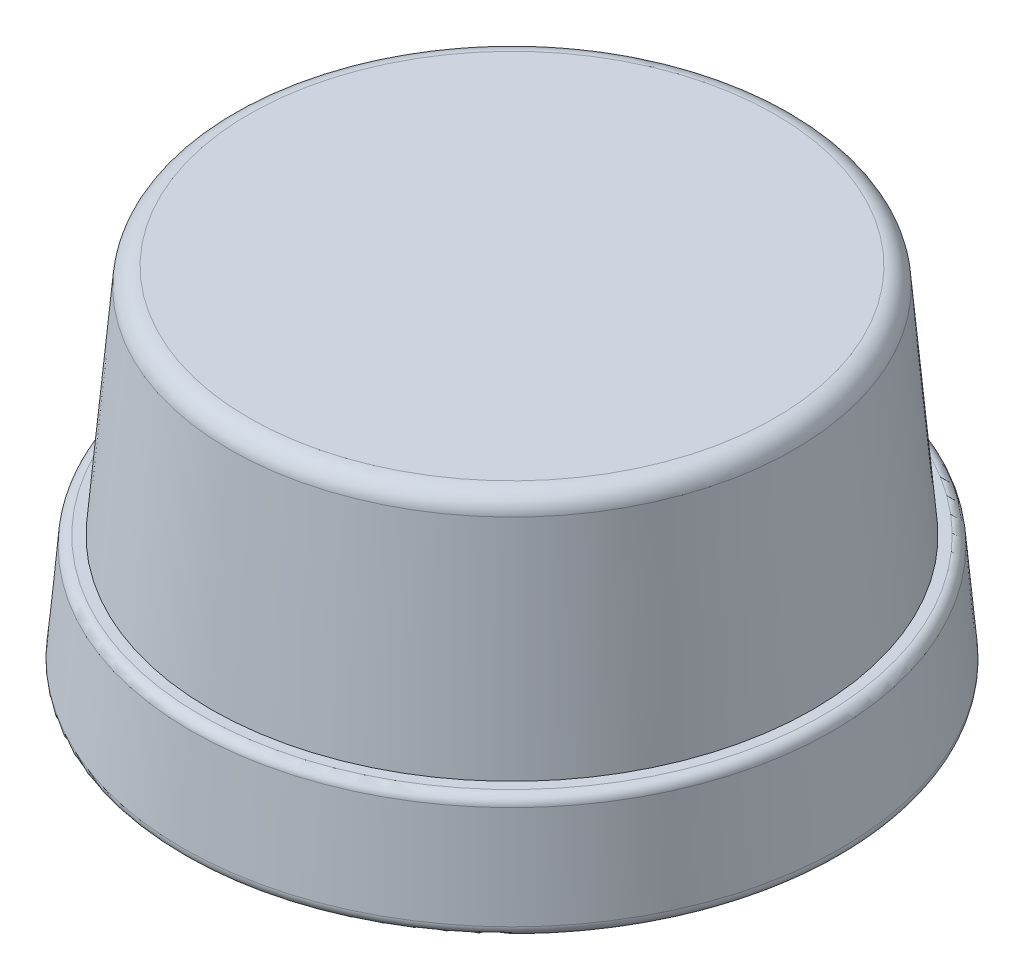
ISO-10303-21;
HEADER;
FILE_DESCRIPTION(('STEP AP214'),'2;1');
FILE_NAME('part.step','',(''),(''),'','','');
FILE_SCHEMA(('AUTOMOTIVE_DESIGN { 1 0 10303 214 1 1 1 1 }'));
ENDSEC;
DATA;
#1=APPLICATION_CONTEXT('core data for automotive mechanical design processes');
#2=APPLICATION_PROTOCOL_DEFINITION('international standard','automotive_design',2000,#1);
#3=PRODUCT_CONTEXT('',#1,'mechanical');
#4=PRODUCT('Part','Part','',(#3));
#5=PRODUCT_RELATED_PRODUCT_CATEGORY('part','',(#4));
#6=PRODUCT_DEFINITION_FORMATION('','',#4);
#7=PRODUCT_DEFINITION_CONTEXT('part definition',#1,'design');
#8=PRODUCT_DEFINITION('design','',#6,#7);
#9=PRODUCT_DEFINITION_SHAPE('','',#8);
#10=(LENGTH_UNIT() NAMED_UNIT(*) SI_UNIT(.MILLI.,.METRE.));
#11=(NAMED_UNIT(*) PLANE_ANGLE_UNIT() SI_UNIT($,.RADIAN.));
#12=(NAMED_UNIT(*) SI_UNIT($,.STERADIAN.) SOLID_ANGLE_UNIT());
#13=UNCERTAINTY_MEASURE_WITH_UNIT(LENGTH_MEASURE(1.E-05),#10,'distance_accuracy_value','');
#14=(GEOMETRIC_REPRESENTATION_CONTEXT(3) GLOBAL_UNCERTAINTY_ASSIGNED_CONTEXT((#13)) GLOBAL_UNIT_ASSIGNED_CONTEXT((#10,
#11,#12)) REPRESENTATION_CONTEXT('',''));
#15=CARTESIAN_POINT('',(0.,0.,0.));
#16=DIRECTION('',(0.,0.,1.));
#17=DIRECTION('',(1.,0.,0.));
#18=AXIS2_PLACEMENT_3D('',#15,#16,#17);
#19=CARTESIAN_POINT('',(0.,0.,0.));
#20=DIRECTION('',(0.,-1.,0.));
#21=DIRECTION('',(0.,0.,1.));
#22=AXIS2_PLACEMENT_3D('',#19,#20,#21);
#23=CONICAL_SURFACE('',#22,17.,0.0872664625997167);
#24=CARTESIAN_POINT('',(0.,0.543577871373824,0.));
#25=DIRECTION('',(0.,1.,0.));
#26=DIRECTION('',(0.,0.,1.));
#27=AXIS2_PLACEMENT_3D('',#24,#25,#26);
#28=CIRCLE('',#27,16.9524430985112);
#29=CARTESIAN_POINT('',(0.,0.543577871373824,16.9524430985112));
#30=VERTEX_POINT('',#29);
#31=EDGE_CURVE('E38',#30,#30,#28,.T.);
#32=ORIENTED_EDGE('',*,*,#31,.T.);
#33=EDGE_LOOP('',(#32));
#34=FACE_BOUND('',#33,.T.);
#35=CARTESIAN_POINT('',(0.,5.54357787137383,0.));
#36=DIRECTION('',(0.,-1.,0.));
#37=DIRECTION('',(0.,0.,-1.));
#38=AXIS2_PLACEMENT_3D('',#35,#36,#37);
#39=CIRCLE('',#38,16.5149997808816);
#40=CARTESIAN_POINT('',(0.,5.54357787137383,-16.5149997808816));
#41=VERTEX_POINT('',#40);
#42=EDGE_CURVE('E42',#41,#41,#39,.T.);
#43=ORIENTED_EDGE('',*,*,#42,.T.);
#44=EDGE_LOOP('',(#43));
#45=FACE_BOUND('',#44,.T.);
#46=ADVANCED_FACE('F31',(#34,#45),#23,.T.);
#47=CARTESIAN_POINT('',(0.,6.,0.));
#48=DIRECTION('',(0.,1.,0.));
#49=DIRECTION('',(0.,0.,1.));
#50=AXIS2_PLACEMENT_3D('',#47,#48,#49);
#51=PLANE('',#50);
#52=CARTESIAN_POINT('',(0.,6.,0.));
#53=DIRECTION('',(0.,1.,0.));
#54=DIRECTION('',(0.,0.,1.));
#55=AXIS2_PLACEMENT_3D('',#52,#53,#54);
#56=CIRCLE('',#55,16.0169024318357);
#57=CARTESIAN_POINT('',(0.,6.,16.0169024318357));
#58=VERTEX_POINT('',#57);
#59=EDGE_CURVE('E46',#58,#58,#56,.T.);
#60=ORIENTED_EDGE('',*,*,#59,.T.);
#61=EDGE_LOOP('',(#60));
#62=FACE_BOUND('',#61,.T.);
#63=CARTESIAN_POINT('',(0.,6.,0.));
#64=DIRECTION('',(0.,1.,0.));
#65=DIRECTION('',(0.,0.,1.));
#66=AXIS2_PLACEMENT_3D('',#63,#64,#65);
#67=CIRCLE('',#66,15.5);
#68=CARTESIAN_POINT('',(0.,6.,15.5));
#69=VERTEX_POINT('',#68);
#70=EDGE_CURVE('E62',#69,#69,#67,.T.);
#71=ORIENTED_EDGE('',*,*,#70,.F.);
#72=EDGE_LOOP('',(#71));
#73=FACE_BOUND('',#72,.T.);
#74=ADVANCED_FACE('F86',(#62,#73),#51,.T.);
#75=CARTESIAN_POINT('',(0.,0.,0.));
#76=DIRECTION('',(0.,1.,0.));
#77=DIRECTION('',(0.,0.,1.));
#78=AXIS2_PLACEMENT_3D('',#75,#76,#77);
#79=PLANE('',#78);
#80=CARTESIAN_POINT('',(0.,0.,0.));
#81=DIRECTION('',(0.,1.,0.));
#82=DIRECTION('',(0.,0.,1.));
#83=AXIS2_PLACEMENT_3D('',#80,#81,#82);
#84=CIRCLE('',#83,16.4543457494654);
#85=CARTESIAN_POINT('',(0.,0.,16.4543457494654));
#86=VERTEX_POINT('',#85);
#87=EDGE_CURVE('E10',#86,#86,#84,.F.);
#88=ORIENTED_EDGE('',*,*,#87,.T.);
#89=EDGE_LOOP('',(#88));
#90=FACE_BOUND('',#89,.T.);
#91=CARTESIAN_POINT('',(0.,0.,0.));
#92=DIRECTION('',(0.,-1.,0.));
#93=DIRECTION('',(0.,0.,-1.));
#94=AXIS2_PLACEMENT_3D('',#91,#92,#93);
#95=CIRCLE('',#94,4.5);
#96=CARTESIAN_POINT('',(0.,0.,-4.5));
#97=VERTEX_POINT('',#96);
#98=EDGE_CURVE('E67',#97,#97,#95,.T.);
#99=ORIENTED_EDGE('',*,*,#98,.F.);
#100=EDGE_LOOP('',(#99));
#101=FACE_BOUND('',#100,.T.);
#102=ADVANCED_FACE('F83',(#90,#101),#79,.F.);
#103=CARTESIAN_POINT('',(0.,6.,0.));
#104=DIRECTION('',(0.,-1.,0.));
#105=DIRECTION('',(0.,0.,1.));
#106=AXIS2_PLACEMENT_3D('',#103,#104,#105);
#107=CONICAL_SURFACE('',#106,15.5,0.0872664625997167);
#108=CARTESIAN_POINT('',(0.,17.0871557427477,0.));
#109=DIRECTION('',(0.,-1.,0.));
#110=DIRECTION('',(0.,0.,-1.));
#111=AXIS2_PLACEMENT_3D('',#108,#109,#110);
#112=CIRCLE('',#111,14.5299995617632);
#113=CARTESIAN_POINT('',(0.,17.0871557427477,-14.5299995617632));
#114=VERTEX_POINT('',#113);
#115=EDGE_CURVE('E56',#114,#114,#112,.T.);
#116=ORIENTED_EDGE('',*,*,#115,.T.);
#117=EDGE_LOOP('',(#116));
#118=FACE_BOUND('',#117,.T.);
#119=ORIENTED_EDGE('',*,*,#70,.T.);
#120=EDGE_LOOP('',(#119));
#121=FACE_BOUND('',#120,.T.);
#122=ADVANCED_FACE('F85',(#118,#121),#107,.T.);
#123=CARTESIAN_POINT('',(0.,18.,0.));
#124=DIRECTION('',(0.,1.,0.));
#125=DIRECTION('',(0.,0.,1.));
#126=AXIS2_PLACEMENT_3D('',#123,#124,#125);
#127=PLANE('',#126);
#128=CARTESIAN_POINT('',(0.,18.,0.));
#129=DIRECTION('',(0.,1.,0.));
#130=DIRECTION('',(0.,0.,1.));
#131=AXIS2_PLACEMENT_3D('',#128,#129,#130);
#132=CIRCLE('',#131,13.5338048636715);
#133=CARTESIAN_POINT('',(0.,18.,13.5338048636715));
#134=VERTEX_POINT('',#133);
#135=EDGE_CURVE('E59',#134,#134,#132,.T.);
#136=ORIENTED_EDGE('',*,*,#135,.T.);
#137=EDGE_LOOP('',(#136));
#138=FACE_BOUND('',#137,.T.);
#139=ADVANCED_FACE('F92',(#138),#127,.T.);
#140=CARTESIAN_POINT('',(0.,17.,0.));
#141=DIRECTION('',(0.,1.,0.));
#142=DIRECTION('',(0.,0.,1.));
#143=AXIS2_PLACEMENT_3D('',#140,#141,#142);
#144=TOROIDAL_SURFACE('',#143,13.5338048636715,1.);
#145=ORIENTED_EDGE('',*,*,#115,.F.);
#146=EDGE_LOOP('',(#145));
#147=FACE_BOUND('',#146,.T.);
#148=ORIENTED_EDGE('',*,*,#135,.F.);
#149=EDGE_LOOP('',(#148));
#150=FACE_BOUND('',#149,.T.);
#151=ADVANCED_FACE('F103',(#147,#150),#144,.T.);
#152=CARTESIAN_POINT('',(0.,5.5,0.));
#153=DIRECTION('',(0.,1.,0.));
#154=DIRECTION('',(0.,0.,1.));
#155=AXIS2_PLACEMENT_3D('',#152,#153,#154);
#156=TOROIDAL_SURFACE('',#155,16.0169024318357,0.5);
#157=ORIENTED_EDGE('',*,*,#42,.F.);
#158=EDGE_LOOP('',(#157));
#159=FACE_BOUND('',#158,.T.);
#160=ORIENTED_EDGE('',*,*,#59,.F.);
#161=EDGE_LOOP('',(#160));
#162=FACE_BOUND('',#161,.T.);
#163=ADVANCED_FACE('F105',(#159,#162),#156,.T.);
#164=CARTESIAN_POINT('',(0.,8.,0.));
#165=DIRECTION('',(0.,-1.,0.));
#166=DIRECTION('',(0.,0.,-1.));
#167=AXIS2_PLACEMENT_3D('',#164,#165,#166);
#168=PLANE('',#167);
#169=CARTESIAN_POINT('',(0.,8.,0.));
#170=DIRECTION('',(0.,-1.,0.));
#171=DIRECTION('',(0.,0.,-1.));
#172=AXIS2_PLACEMENT_3D('',#169,#170,#171);
#173=CIRCLE('',#172,4.5);
#174=CARTESIAN_POINT('',(0.,8.,-4.5));
#175=VERTEX_POINT('',#174);
#176=EDGE_CURVE('E52',#175,#175,#173,.T.);
#177=ORIENTED_EDGE('',*,*,#176,.T.);
#178=EDGE_LOOP('',(#177));
#179=FACE_BOUND('',#178,.T.);
#180=CARTESIAN_POINT('',(0.,8.,0.));
#181=DIRECTION('',(0.,-1.,0.));
#182=DIRECTION('',(0.,0.,-1.));
#183=AXIS2_PLACEMENT_3D('',#180,#181,#182);
#184=CIRCLE('',#183,3.05);
#185=CARTESIAN_POINT('',(0.,8.,-3.05));
#186=VERTEX_POINT('',#185);
#187=EDGE_CURVE('E49',#186,#186,#184,.F.);
#188=ORIENTED_EDGE('',*,*,#187,.T.);
#189=EDGE_LOOP('',(#188));
#190=FACE_BOUND('',#189,.T.);
#191=ADVANCED_FACE('F73',(#179,#190),#168,.T.);
#192=CARTESIAN_POINT('',(0.,8.,0.));
#193=DIRECTION('',(0.,-1.,0.));
#194=DIRECTION('',(0.,0.,-1.));
#195=AXIS2_PLACEMENT_3D('',#192,#193,#194);
#196=CYLINDRICAL_SURFACE('',#195,4.5);
#197=ORIENTED_EDGE('',*,*,#176,.F.);
#198=EDGE_LOOP('',(#197));
#199=FACE_BOUND('',#198,.T.);
#200=ORIENTED_EDGE('',*,*,#98,.T.);
#201=EDGE_LOOP('',(#200));
#202=FACE_BOUND('',#201,.T.);
#203=ADVANCED_FACE('F76',(#199,#202),#196,.F.);
#204=CARTESIAN_POINT('',(0.,17.,0.));
#205=DIRECTION('',(0.,-1.,0.));
#206=DIRECTION('',(0.,0.,-1.));
#207=AXIS2_PLACEMENT_3D('',#204,#205,#206);
#208=PLANE('',#207);
#209=CARTESIAN_POINT('',(0.,17.,0.));
#210=DIRECTION('',(0.,-1.,0.));
#211=DIRECTION('',(0.,0.,-1.));
#212=AXIS2_PLACEMENT_3D('',#209,#210,#211);
#213=CIRCLE('',#212,3.05);
#214=CARTESIAN_POINT('',(0.,17.,-3.05));
#215=VERTEX_POINT('',#214);
#216=EDGE_CURVE('E51',#215,#215,#213,.T.);
#217=ORIENTED_EDGE('',*,*,#216,.T.);
#218=EDGE_LOOP('',(#217));
#219=FACE_BOUND('',#218,.T.);
#220=ADVANCED_FACE('F79',(#219),#208,.T.);
#221=CARTESIAN_POINT('',(0.,17.,0.));
#222=DIRECTION('',(0.,-1.,0.));
#223=DIRECTION('',(0.,0.,-1.));
#224=AXIS2_PLACEMENT_3D('',#221,#222,#223);
#225=CYLINDRICAL_SURFACE('',#224,3.05);
#226=ORIENTED_EDGE('',*,*,#216,.F.);
#227=EDGE_LOOP('',(#226));
#228=FACE_BOUND('',#227,.T.);
#229=ORIENTED_EDGE('',*,*,#187,.F.);
#230=EDGE_LOOP('',(#229));
#231=FACE_BOUND('',#230,.T.);
#232=ADVANCED_FACE('F124',(#228,#231),#225,.F.);
#233=CARTESIAN_POINT('',(0.,0.5,0.));
#234=DIRECTION('',(0.,1.,0.));
#235=DIRECTION('',(0.,0.,1.));
#236=AXIS2_PLACEMENT_3D('',#233,#234,#235);
#237=TOROIDAL_SURFACE('',#236,16.4543457494654,0.5);
#238=ORIENTED_EDGE('',*,*,#87,.F.);
#239=EDGE_LOOP('',(#238));
#240=FACE_BOUND('',#239,.T.);
#241=ORIENTED_EDGE('',*,*,#31,.F.);
#242=EDGE_LOOP('',(#241));
#243=FACE_BOUND('',#242,.T.);
#244=ADVANCED_FACE('F33',(#240,#243),#237,.T.);
#245=CLOSED_SHELL('',(#46,#74,#102,#122,#139,#151,#163,#191,#203,#220,#232,#244));
#246=MANIFOLD_SOLID_BREP('B2',#245);
#247=ADVANCED_BREP_SHAPE_REPRESENTATION('',(#18,#246),#14);
#248=SHAPE_DEFINITION_REPRESENTATION(#9,#247);
ENDSEC;
END-ISO-10303-21;
